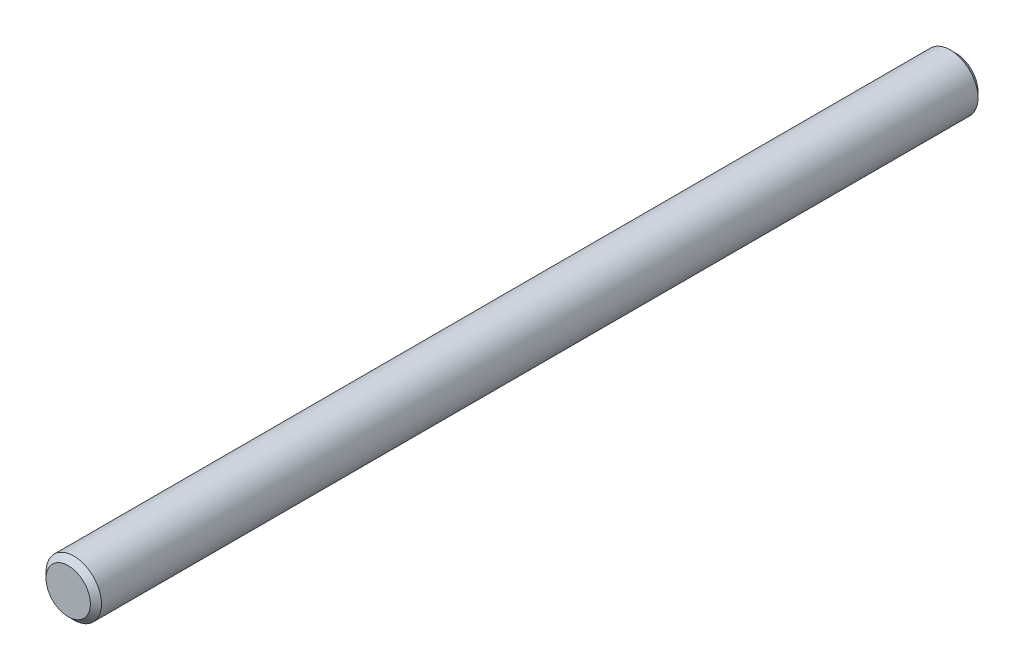
ISO-10303-21;
HEADER;
FILE_DESCRIPTION(('STEP AP214'),'2;1');
FILE_NAME('part.step','',(''),(''),'','','');
FILE_SCHEMA(('AUTOMOTIVE_DESIGN { 1 0 10303 214 1 1 1 1 }'));
ENDSEC;
DATA;
#1=APPLICATION_CONTEXT('core data for automotive mechanical design processes');
#2=APPLICATION_PROTOCOL_DEFINITION('international standard','automotive_design',2000,#1);
#3=PRODUCT_CONTEXT('',#1,'mechanical');
#4=PRODUCT('Part','Part','',(#3));
#5=PRODUCT_RELATED_PRODUCT_CATEGORY('part','',(#4));
#6=PRODUCT_DEFINITION_FORMATION('','',#4);
#7=PRODUCT_DEFINITION_CONTEXT('part definition',#1,'design');
#8=PRODUCT_DEFINITION('design','',#6,#7);
#9=PRODUCT_DEFINITION_SHAPE('','',#8);
#10=(LENGTH_UNIT() NAMED_UNIT(*) SI_UNIT(.MILLI.,.METRE.));
#11=(NAMED_UNIT(*) PLANE_ANGLE_UNIT() SI_UNIT($,.RADIAN.));
#12=(NAMED_UNIT(*) SI_UNIT($,.STERADIAN.) SOLID_ANGLE_UNIT());
#13=UNCERTAINTY_MEASURE_WITH_UNIT(LENGTH_MEASURE(1.E-05),#10,'distance_accuracy_value','');
#14=(GEOMETRIC_REPRESENTATION_CONTEXT(3) GLOBAL_UNCERTAINTY_ASSIGNED_CONTEXT((#13)) GLOBAL_UNIT_ASSIGNED_CONTEXT((#10,
#11,#12)) REPRESENTATION_CONTEXT('',''));
#15=CARTESIAN_POINT('',(0.,0.,0.));
#16=DIRECTION('',(0.,0.,1.));
#17=DIRECTION('',(1.,0.,0.));
#18=AXIS2_PLACEMENT_3D('',#15,#16,#17);
#19=CARTESIAN_POINT('',(0.,0.,50.8));
#20=DIRECTION('',(0.,0.,-1.));
#21=DIRECTION('',(-1.,0.,0.));
#22=AXIS2_PLACEMENT_3D('',#19,#20,#21);
#23=CYLINDRICAL_SURFACE('',#22,3.175);
#24=CARTESIAN_POINT('',(0.,0.,50.165));
#25=DIRECTION('',(0.,0.,1.));
#26=DIRECTION('',(1.,0.,0.));
#27=AXIS2_PLACEMENT_3D('',#24,#25,#26);
#28=CIRCLE('',#27,3.175);
#29=CARTESIAN_POINT('',(3.175,0.,50.165));
#30=VERTEX_POINT('',#29);
#31=EDGE_CURVE('E37',#30,#30,#28,.F.);
#32=ORIENTED_EDGE('',*,*,#31,.T.);
#33=EDGE_LOOP('',(#32));
#34=FACE_BOUND('',#33,.T.);
#35=CARTESIAN_POINT('',(0.,0.,-50.165));
#36=DIRECTION('',(0.,0.,1.));
#37=DIRECTION('',(1.,0.,0.));
#38=AXIS2_PLACEMENT_3D('',#35,#36,#37);
#39=CIRCLE('',#38,3.175);
#40=CARTESIAN_POINT('',(3.175,0.,-50.165));
#41=VERTEX_POINT('',#40);
#42=EDGE_CURVE('E41',#41,#41,#39,.T.);
#43=ORIENTED_EDGE('',*,*,#42,.T.);
#44=EDGE_LOOP('',(#43));
#45=FACE_BOUND('',#44,.T.);
#46=ADVANCED_FACE('F30',(#34,#45),#23,.T.);
#47=CARTESIAN_POINT('',(0.,0.,50.8));
#48=DIRECTION('',(0.,0.,1.));
#49=DIRECTION('',(1.,0.,0.));
#50=AXIS2_PLACEMENT_3D('',#47,#48,#49);
#51=PLANE('',#50);
#52=CARTESIAN_POINT('',(0.,0.,50.8));
#53=DIRECTION('',(0.,0.,1.));
#54=DIRECTION('',(1.,0.,0.));
#55=AXIS2_PLACEMENT_3D('',#52,#53,#54);
#56=CIRCLE('',#55,2.54);
#57=CARTESIAN_POINT('',(2.54,0.,50.8));
#58=VERTEX_POINT('',#57);
#59=EDGE_CURVE('E45',#58,#58,#56,.T.);
#60=ORIENTED_EDGE('',*,*,#59,.T.);
#61=EDGE_LOOP('',(#60));
#62=FACE_BOUND('',#61,.T.);
#63=ADVANCED_FACE('F51',(#62),#51,.T.);
#64=CARTESIAN_POINT('',(0.,0.,-50.8));
#65=DIRECTION('',(0.,0.,1.));
#66=DIRECTION('',(1.,0.,0.));
#67=AXIS2_PLACEMENT_3D('',#64,#65,#66);
#68=PLANE('',#67);
#69=CARTESIAN_POINT('',(0.,0.,-50.8));
#70=DIRECTION('',(0.,0.,1.));
#71=DIRECTION('',(1.,0.,0.));
#72=AXIS2_PLACEMENT_3D('',#69,#70,#71);
#73=CIRCLE('',#72,2.54000000000001);
#74=CARTESIAN_POINT('',(2.54000000000001,0.,-50.8));
#75=VERTEX_POINT('',#74);
#76=EDGE_CURVE('E10',#75,#75,#73,.F.);
#77=ORIENTED_EDGE('',*,*,#76,.T.);
#78=EDGE_LOOP('',(#77));
#79=FACE_BOUND('',#78,.T.);
#80=ADVANCED_FACE('F55',(#79),#68,.F.);
#81=CARTESIAN_POINT('',(0.,0.,50.8));
#82=DIRECTION('',(0.,0.,-1.));
#83=DIRECTION('',(-1.,0.,0.));
#84=AXIS2_PLACEMENT_3D('',#81,#82,#83);
#85=CONICAL_SURFACE('',#84,2.54,0.78539816339745);
#86=ORIENTED_EDGE('',*,*,#31,.F.);
#87=EDGE_LOOP('',(#86));
#88=FACE_BOUND('',#87,.T.);
#89=ORIENTED_EDGE('',*,*,#59,.F.);
#90=EDGE_LOOP('',(#89));
#91=FACE_BOUND('',#90,.T.);
#92=ADVANCED_FACE('F53',(#88,#91),#85,.T.);
#93=CARTESIAN_POINT('',(0.,0.,-50.165));
#94=DIRECTION('',(0.,0.,1.));
#95=DIRECTION('',(1.,0.,0.));
#96=AXIS2_PLACEMENT_3D('',#93,#94,#95);
#97=CONICAL_SURFACE('',#96,3.175,0.78539816339745);
#98=CARTESIAN_POINT('',(2.54000000000001,0.,-50.8));
#99=CARTESIAN_POINT('',(2.54661458333334,0.,-50.7933854166667));
#100=CARTESIAN_POINT('',(2.55322916666668,0.,-50.7867708333333));
#101=CARTESIAN_POINT('',(2.56645833333334,0.,-50.7735416666667));
#102=CARTESIAN_POINT('',(2.57307291666668,0.,-50.7669270833333));
#103=CARTESIAN_POINT('',(2.58630208333334,0.,-50.7536979166667));
#104=CARTESIAN_POINT('',(2.59291666666668,0.,-50.7470833333333));
#105=CARTESIAN_POINT('',(2.60614583333334,0.,-50.7338541666667));
#106=CARTESIAN_POINT('',(2.61276041666668,0.,-50.7272395833333));
#107=CARTESIAN_POINT('',(2.62598958333334,0.,-50.7140104166667));
#108=CARTESIAN_POINT('',(2.63260416666668,0.,-50.7073958333333));
#109=CARTESIAN_POINT('',(2.64583333333334,0.,-50.6941666666667));
#110=CARTESIAN_POINT('',(2.65244791666667,0.,-50.6875520833333));
#111=CARTESIAN_POINT('',(2.66567708333334,0.,-50.6743229166667));
#112=CARTESIAN_POINT('',(2.67229166666667,0.,-50.6677083333333));
#113=CARTESIAN_POINT('',(2.68552083333334,0.,-50.6544791666667));
#114=CARTESIAN_POINT('',(2.69213541666667,0.,-50.6478645833333));
#115=CARTESIAN_POINT('',(2.70536458333334,0.,-50.6346354166667));
#116=CARTESIAN_POINT('',(2.71197916666667,0.,-50.6280208333333));
#117=CARTESIAN_POINT('',(2.72520833333334,0.,-50.6147916666667));
#118=CARTESIAN_POINT('',(2.73182291666667,0.,-50.6081770833333));
#119=CARTESIAN_POINT('',(2.74505208333334,0.,-50.5949479166667));
#120=CARTESIAN_POINT('',(2.75166666666667,0.,-50.5883333333333));
#121=CARTESIAN_POINT('',(2.76489583333334,0.,-50.5751041666667));
#122=CARTESIAN_POINT('',(2.77151041666667,0.,-50.5684895833333));
#123=CARTESIAN_POINT('',(2.78473958333334,0.,-50.5552604166667));
#124=CARTESIAN_POINT('',(2.79135416666667,0.,-50.5486458333333));
#125=CARTESIAN_POINT('',(2.80458333333334,0.,-50.5354166666667));
#126=CARTESIAN_POINT('',(2.81119791666667,0.,-50.5288020833333));
#127=CARTESIAN_POINT('',(2.82442708333334,0.,-50.5155729166667));
#128=CARTESIAN_POINT('',(2.83104166666667,0.,-50.5089583333333));
#129=CARTESIAN_POINT('',(2.84427083333334,0.,-50.4957291666667));
#130=CARTESIAN_POINT('',(2.85088541666667,0.,-50.4891145833333));
#131=CARTESIAN_POINT('',(2.86411458333334,0.,-50.4758854166667));
#132=CARTESIAN_POINT('',(2.87072916666667,0.,-50.4692708333333));
#133=CARTESIAN_POINT('',(2.88395833333334,0.,-50.4560416666667));
#134=CARTESIAN_POINT('',(2.89057291666667,0.,-50.4494270833333));
#135=CARTESIAN_POINT('',(2.90380208333334,0.,-50.4361979166667));
#136=CARTESIAN_POINT('',(2.91041666666667,0.,-50.4295833333333));
#137=CARTESIAN_POINT('',(2.92364583333334,0.,-50.4163541666667));
#138=CARTESIAN_POINT('',(2.93026041666667,0.,-50.4097395833333));
#139=CARTESIAN_POINT('',(2.94348958333334,0.,-50.3965104166667));
#140=CARTESIAN_POINT('',(2.95010416666667,0.,-50.3898958333333));
#141=CARTESIAN_POINT('',(2.96333333333334,0.,-50.3766666666667));
#142=CARTESIAN_POINT('',(2.96994791666667,0.,-50.3700520833333));
#143=CARTESIAN_POINT('',(2.98317708333333,0.,-50.3568229166667));
#144=CARTESIAN_POINT('',(2.98979166666667,0.,-50.3502083333333));
#145=CARTESIAN_POINT('',(3.00302083333333,0.,-50.3369791666667));
#146=CARTESIAN_POINT('',(3.00963541666667,0.,-50.3303645833333));
#147=CARTESIAN_POINT('',(3.02286458333333,0.,-50.3171354166667));
#148=CARTESIAN_POINT('',(3.02947916666667,0.,-50.3105208333333));
#149=CARTESIAN_POINT('',(3.04270833333333,0.,-50.2972916666667));
#150=CARTESIAN_POINT('',(3.04932291666667,0.,-50.2906770833333));
#151=CARTESIAN_POINT('',(3.06255208333333,0.,-50.2774479166667));
#152=CARTESIAN_POINT('',(3.06916666666667,0.,-50.2708333333333));
#153=CARTESIAN_POINT('',(3.08239583333333,0.,-50.2576041666667));
#154=CARTESIAN_POINT('',(3.08901041666666,0.,-50.2509895833334));
#155=CARTESIAN_POINT('',(3.10223958333333,0.,-50.2377604166667));
#156=CARTESIAN_POINT('',(3.10885416666666,0.,-50.2311458333334));
#157=CARTESIAN_POINT('',(3.12208333333333,0.,-50.2179166666667));
#158=CARTESIAN_POINT('',(3.12869791666666,0.,-50.2113020833334));
#159=CARTESIAN_POINT('',(3.14192708333333,0.,-50.1980729166667));
#160=CARTESIAN_POINT('',(3.14854166666666,0.,-50.1914583333334));
#161=CARTESIAN_POINT('',(3.16177083333333,0.,-50.1782291666667));
#162=CARTESIAN_POINT('',(3.16838541666666,0.,-50.1716145833334));
#163=CARTESIAN_POINT('',(3.175,0.,-50.165));
#164=B_SPLINE_CURVE_WITH_KNOTS('',3,(#98,#99,#100,#101,#102,#103,#104,#105,#106,#107,#108,#109,
#110,#111,#112,#113,#114,#115,#116,#117,#118,#119,#120,#121,#122,#123,#124,#125,#126,#127,#128,
#129,#130,#131,#132,#133,#134,#135,#136,#137,#138,#139,#140,#141,#142,#143,#144,#145,#146,#147,
#148,#149,#150,#151,#152,#153,#154,#155,#156,#157,#158,#159,#160,#161,#162,#163),.UNSPECIFIED.,
.F.,.F.,(4,2,2,2,2,2,2,2,2,2,2,2,2,2,2,2,2,2,2,2,2,2,2,2,2,2,2,2,2,2,2,2,4),(0.,
0.0280633003783443,0.0561266007566837,0.0841899011350232,0.112253201513363,0.140316501891702,
0.168379802270047,0.196443102648386,0.224506403026726,0.252569703405065,0.280633003783405,
0.308696304161749,0.336759604540088,0.364822904918428,0.392886205296767,0.420949505675107,
0.449012806053446,0.477076106431791,0.50513940681013,0.53320270718847,0.561266007566809,
0.589329307945149,0.617392608323493,0.645455908701832,0.673519209080172,0.701582509458512,
0.729645809836851,0.757709110215195,0.785772410593535,0.813835710971874,0.841899011350214,
0.869962311728554,0.898025612106898),.UNSPECIFIED.);
#165=EDGE_CURVE('BSEAM32',#75,#41,#164,.T.);
#166=ORIENTED_EDGE('',*,*,#76,.F.);
#167=ORIENTED_EDGE('',*,*,#42,.F.);
#168=ORIENTED_EDGE('',*,*,#165,.T.);
#169=ORIENTED_EDGE('',*,*,#165,.F.);
#170=EDGE_LOOP('',(#166,#168,#167,#169));
#171=FACE_BOUND('',#170,.T.);
#172=ADVANCED_FACE('F32',(#171),#97,.T.);
#173=CLOSED_SHELL('',(#46,#63,#80,#92,#172));
#174=MANIFOLD_SOLID_BREP('B2',#173);
#175=ADVANCED_BREP_SHAPE_REPRESENTATION('',(#18,#174),#14);
#176=SHAPE_DEFINITION_REPRESENTATION(#9,#175);
ENDSEC;
END-ISO-10303-21;
